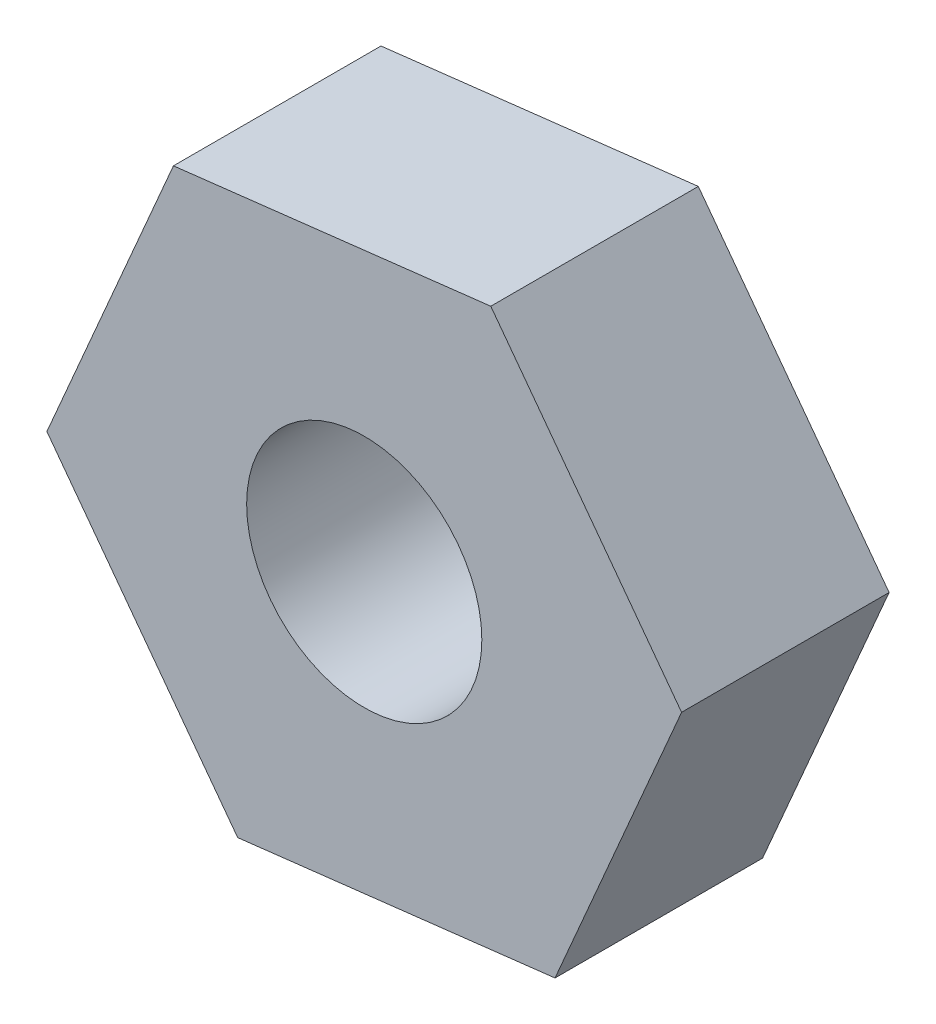
ISO-10303-21;
HEADER;
FILE_DESCRIPTION(('STEP AP214'),'2;1');
FILE_NAME('part.step','',(''),(''),'','','');
FILE_SCHEMA(('AUTOMOTIVE_DESIGN { 1 0 10303 214 1 1 1 1 }'));
ENDSEC;
DATA;
#1=APPLICATION_CONTEXT('core data for automotive mechanical design processes');
#2=APPLICATION_PROTOCOL_DEFINITION('international standard','automotive_design',2000,#1);
#3=PRODUCT_CONTEXT('',#1,'mechanical');
#4=PRODUCT('Part','Part','',(#3));
#5=PRODUCT_RELATED_PRODUCT_CATEGORY('part','',(#4));
#6=PRODUCT_DEFINITION_FORMATION('','',#4);
#7=PRODUCT_DEFINITION_CONTEXT('part definition',#1,'design');
#8=PRODUCT_DEFINITION('design','',#6,#7);
#9=PRODUCT_DEFINITION_SHAPE('','',#8);
#10=(LENGTH_UNIT() NAMED_UNIT(*) SI_UNIT(.MILLI.,.METRE.));
#11=(NAMED_UNIT(*) PLANE_ANGLE_UNIT() SI_UNIT($,.RADIAN.));
#12=(NAMED_UNIT(*) SI_UNIT($,.STERADIAN.) SOLID_ANGLE_UNIT());
#13=UNCERTAINTY_MEASURE_WITH_UNIT(LENGTH_MEASURE(1.E-05),#10,'distance_accuracy_value','');
#14=(GEOMETRIC_REPRESENTATION_CONTEXT(3) GLOBAL_UNCERTAINTY_ASSIGNED_CONTEXT((#13)) GLOBAL_UNIT_ASSIGNED_CONTEXT((#10,
#11,#12)) REPRESENTATION_CONTEXT('',''));
#15=CARTESIAN_POINT('',(0.,0.,0.));
#16=DIRECTION('',(0.,0.,1.));
#17=DIRECTION('',(1.,0.,0.));
#18=AXIS2_PLACEMENT_3D('',#15,#16,#17);
#19=CARTESIAN_POINT('',(0.,0.,1.5));
#20=DIRECTION('',(0.,0.,1.));
#21=DIRECTION('',(1.,0.,0.));
#22=AXIS2_PLACEMENT_3D('',#19,#20,#21);
#23=PLANE('',#22);
#24=DIRECTION('',(0.993240446969853,0.116075038243055,0.));
#25=VECTOR('',#24,1.);
#26=CARTESIAN_POINT('',(-0.914745202370028,-2.12051280309136,1.5));
#27=LINE('',#26,#25);
#28=CARTESIAN_POINT('',(-0.914745202370028,-2.12051280309136,1.5));
#29=VERTEX_POINT('',#28);
#30=CARTESIAN_POINT('',(1.37904535534225,-1.85244898478806,1.5));
#31=VERTEX_POINT('',#30);
#32=EDGE_CURVE('E130',#29,#31,#27,.T.);
#33=ORIENTED_EDGE('',*,*,#32,.T.);
#34=DIRECTION('',(0.39609629162119,0.918208978263631,0.));
#35=VECTOR('',#34,1.);
#36=CARTESIAN_POINT('',(1.37904535534225,-1.85244898478806,1.5));
#37=LINE('',#36,#35);
#38=CARTESIAN_POINT('',(2.29379055771228,0.268063818303296,1.5));
#39=VERTEX_POINT('',#38);
#40=EDGE_CURVE('E88',#31,#39,#37,.T.);
#41=ORIENTED_EDGE('',*,*,#40,.T.);
#42=DIRECTION('',(-0.597144155348662,0.802133940020576,0.));
#43=VECTOR('',#42,1.);
#44=CARTESIAN_POINT('',(2.29379055771228,0.268063818303296,1.5));
#45=LINE('',#44,#43);
#46=CARTESIAN_POINT('',(0.914745202370028,2.12051280309135,1.5));
#47=VERTEX_POINT('',#46);
#48=EDGE_CURVE('E101',#39,#47,#45,.T.);
#49=ORIENTED_EDGE('',*,*,#48,.T.);
#50=DIRECTION('',(-0.993240446969853,-0.116075038243054,0.));
#51=VECTOR('',#50,1.);
#52=CARTESIAN_POINT('',(0.914745202370028,2.12051280309135,1.5));
#53=LINE('',#52,#51);
#54=CARTESIAN_POINT('',(-1.37904535534225,1.85244898478806,1.5));
#55=VERTEX_POINT('',#54);
#56=EDGE_CURVE('E95',#47,#55,#53,.T.);
#57=ORIENTED_EDGE('',*,*,#56,.T.);
#58=DIRECTION('',(-0.396096291621191,-0.918208978263631,0.));
#59=VECTOR('',#58,1.);
#60=CARTESIAN_POINT('',(-1.37904535534225,1.85244898478806,1.5));
#61=LINE('',#60,#59);
#62=CARTESIAN_POINT('',(-2.29379055771228,-0.268063818303295,1.5));
#63=VERTEX_POINT('',#62);
#64=EDGE_CURVE('E99',#55,#63,#61,.T.);
#65=ORIENTED_EDGE('',*,*,#64,.T.);
#66=DIRECTION('',(0.597144155348662,-0.802133940020576,0.));
#67=VECTOR('',#66,1.);
#68=CARTESIAN_POINT('',(-2.29379055771228,-0.268063818303295,1.5));
#69=LINE('',#68,#67);
#70=EDGE_CURVE('E51',#63,#29,#69,.T.);
#71=ORIENTED_EDGE('',*,*,#70,.T.);
#72=EDGE_LOOP('',(#33,#41,#49,#57,#65,#71));
#73=FACE_BOUND('',#72,.T.);
#74=CARTESIAN_POINT('',(0.,0.,1.5));
#75=DIRECTION('',(0.,0.,1.));
#76=DIRECTION('',(1.,0.,0.));
#77=AXIS2_PLACEMENT_3D('',#74,#75,#76);
#78=CIRCLE('',#77,0.85);
#79=CARTESIAN_POINT('',(0.85,0.,1.5));
#80=VERTEX_POINT('',#79);
#81=EDGE_CURVE('E123',#80,#80,#78,.T.);
#82=ORIENTED_EDGE('',*,*,#81,.F.);
#83=EDGE_LOOP('',(#82));
#84=FACE_BOUND('',#83,.T.);
#85=ADVANCED_FACE('F34',(#73,#84),#23,.T.);
#86=CARTESIAN_POINT('',(0.,0.,0.));
#87=DIRECTION('',(0.,0.,1.));
#88=DIRECTION('',(1.,0.,0.));
#89=AXIS2_PLACEMENT_3D('',#86,#87,#88);
#90=PLANE('',#89);
#91=DIRECTION('',(0.993240446969853,0.116075038243055,0.));
#92=VECTOR('',#91,1.);
#93=CARTESIAN_POINT('',(-0.914745202370028,-2.12051280309136,0.));
#94=LINE('',#93,#92);
#95=CARTESIAN_POINT('',(-0.914745202370028,-2.12051280309136,0.));
#96=VERTEX_POINT('',#95);
#97=CARTESIAN_POINT('',(1.37904535534225,-1.85244898478806,0.));
#98=VERTEX_POINT('',#97);
#99=EDGE_CURVE('E119',#96,#98,#94,.T.);
#100=ORIENTED_EDGE('',*,*,#99,.F.);
#101=DIRECTION('',(0.597144155348662,-0.802133940020576,0.));
#102=VECTOR('',#101,1.);
#103=CARTESIAN_POINT('',(-2.29379055771228,-0.268063818303295,0.));
#104=LINE('',#103,#102);
#105=CARTESIAN_POINT('',(-2.29379055771228,-0.268063818303295,0.));
#106=VERTEX_POINT('',#105);
#107=EDGE_CURVE('E80',#106,#96,#104,.T.);
#108=ORIENTED_EDGE('',*,*,#107,.F.);
#109=DIRECTION('',(-0.396096291621191,-0.918208978263631,0.));
#110=VECTOR('',#109,1.);
#111=CARTESIAN_POINT('',(-1.37904535534225,1.85244898478806,0.));
#112=LINE('',#111,#110);
#113=CARTESIAN_POINT('',(-1.37904535534225,1.85244898478806,0.));
#114=VERTEX_POINT('',#113);
#115=EDGE_CURVE('E74',#114,#106,#112,.T.);
#116=ORIENTED_EDGE('',*,*,#115,.F.);
#117=DIRECTION('',(-0.993240446969853,-0.116075038243054,0.));
#118=VECTOR('',#117,1.);
#119=CARTESIAN_POINT('',(0.914745202370028,2.12051280309135,0.));
#120=LINE('',#119,#118);
#121=CARTESIAN_POINT('',(0.914745202370028,2.12051280309135,0.));
#122=VERTEX_POINT('',#121);
#123=EDGE_CURVE('E109',#122,#114,#120,.T.);
#124=ORIENTED_EDGE('',*,*,#123,.F.);
#125=DIRECTION('',(-0.597144155348662,0.802133940020576,0.));
#126=VECTOR('',#125,1.);
#127=CARTESIAN_POINT('',(2.29379055771228,0.268063818303296,0.));
#128=LINE('',#127,#126);
#129=CARTESIAN_POINT('',(2.29379055771228,0.268063818303296,0.));
#130=VERTEX_POINT('',#129);
#131=EDGE_CURVE('E125',#130,#122,#128,.T.);
#132=ORIENTED_EDGE('',*,*,#131,.F.);
#133=DIRECTION('',(0.39609629162119,0.918208978263631,0.));
#134=VECTOR('',#133,1.);
#135=CARTESIAN_POINT('',(1.37904535534225,-1.85244898478806,0.));
#136=LINE('',#135,#134);
#137=EDGE_CURVE('E122',#98,#130,#136,.T.);
#138=ORIENTED_EDGE('',*,*,#137,.F.);
#139=EDGE_LOOP('',(#100,#108,#116,#124,#132,#138));
#140=FACE_BOUND('',#139,.T.);
#141=CARTESIAN_POINT('',(0.,0.,0.));
#142=DIRECTION('',(0.,0.,1.));
#143=DIRECTION('',(1.,0.,0.));
#144=AXIS2_PLACEMENT_3D('',#141,#142,#143);
#145=CIRCLE('',#144,0.85);
#146=CARTESIAN_POINT('',(0.85,0.,0.));
#147=VERTEX_POINT('',#146);
#148=EDGE_CURVE('E223',#147,#147,#145,.T.);
#149=ORIENTED_EDGE('',*,*,#148,.T.);
#150=EDGE_LOOP('',(#149));
#151=FACE_BOUND('',#150,.T.);
#152=ADVANCED_FACE('F139',(#140,#151),#90,.F.);
#153=CARTESIAN_POINT('',(-0.914745202370028,-2.12051280309136,1.5));
#154=DIRECTION('',(-0.116075038243055,0.993240446969853,0.));
#155=DIRECTION('',(-0.993240446969853,-0.116075038243055,0.));
#156=AXIS2_PLACEMENT_3D('',#153,#154,#155);
#157=PLANE('',#156);
#158=ORIENTED_EDGE('',*,*,#99,.T.);
#159=DIRECTION('',(0.,0.,-1.));
#160=VECTOR('',#159,1.);
#161=CARTESIAN_POINT('',(1.37904535534225,-1.85244898478806,1.5));
#162=LINE('',#161,#160);
#163=EDGE_CURVE('E11',#31,#98,#162,.T.);
#164=ORIENTED_EDGE('',*,*,#163,.F.);
#165=ORIENTED_EDGE('',*,*,#32,.F.);
#166=DIRECTION('',(0.,0.,-1.));
#167=VECTOR('',#166,1.);
#168=CARTESIAN_POINT('',(-0.914745202370028,-2.12051280309136,1.5));
#169=LINE('',#168,#167);
#170=EDGE_CURVE('E115',#29,#96,#169,.T.);
#171=ORIENTED_EDGE('',*,*,#170,.T.);
#172=EDGE_LOOP('',(#158,#164,#165,#171));
#173=FACE_BOUND('',#172,.T.);
#174=ADVANCED_FACE('F36',(#173),#157,.F.);
#175=CARTESIAN_POINT('',(1.37904535534225,-1.85244898478806,1.5));
#176=DIRECTION('',(-0.918208978263631,0.39609629162119,0.));
#177=DIRECTION('',(-0.39609629162119,-0.918208978263631,0.));
#178=AXIS2_PLACEMENT_3D('',#175,#176,#177);
#179=PLANE('',#178);
#180=ORIENTED_EDGE('',*,*,#137,.T.);
#181=DIRECTION('',(0.,0.,-1.));
#182=VECTOR('',#181,1.);
#183=CARTESIAN_POINT('',(2.29379055771228,0.268063818303296,1.5));
#184=LINE('',#183,#182);
#185=EDGE_CURVE('E43',#39,#130,#184,.T.);
#186=ORIENTED_EDGE('',*,*,#185,.F.);
#187=ORIENTED_EDGE('',*,*,#40,.F.);
#188=ORIENTED_EDGE('',*,*,#163,.T.);
#189=EDGE_LOOP('',(#180,#186,#187,#188));
#190=FACE_BOUND('',#189,.T.);
#191=ADVANCED_FACE('F164',(#190),#179,.F.);
#192=CARTESIAN_POINT('',(2.29379055771228,0.268063818303296,1.5));
#193=DIRECTION('',(-0.802133940020576,-0.597144155348662,0.));
#194=DIRECTION('',(0.597144155348662,-0.802133940020576,0.));
#195=AXIS2_PLACEMENT_3D('',#192,#193,#194);
#196=PLANE('',#195);
#197=ORIENTED_EDGE('',*,*,#131,.T.);
#198=DIRECTION('',(0.,0.,-1.));
#199=VECTOR('',#198,1.);
#200=CARTESIAN_POINT('',(0.914745202370028,2.12051280309135,1.5));
#201=LINE('',#200,#199);
#202=EDGE_CURVE('E110',#47,#122,#201,.T.);
#203=ORIENTED_EDGE('',*,*,#202,.F.);
#204=ORIENTED_EDGE('',*,*,#48,.F.);
#205=ORIENTED_EDGE('',*,*,#185,.T.);
#206=EDGE_LOOP('',(#197,#203,#204,#205));
#207=FACE_BOUND('',#206,.T.);
#208=ADVANCED_FACE('F136',(#207),#196,.F.);
#209=CARTESIAN_POINT('',(0.914745202370028,2.12051280309135,1.5));
#210=DIRECTION('',(0.116075038243054,-0.993240446969853,0.));
#211=DIRECTION('',(0.993240446969853,0.116075038243054,0.));
#212=AXIS2_PLACEMENT_3D('',#209,#210,#211);
#213=PLANE('',#212);
#214=ORIENTED_EDGE('',*,*,#123,.T.);
#215=DIRECTION('',(0.,0.,-1.));
#216=VECTOR('',#215,1.);
#217=CARTESIAN_POINT('',(-1.37904535534225,1.85244898478806,1.5));
#218=LINE('',#217,#216);
#219=EDGE_CURVE('E106',#55,#114,#218,.T.);
#220=ORIENTED_EDGE('',*,*,#219,.F.);
#221=ORIENTED_EDGE('',*,*,#56,.F.);
#222=ORIENTED_EDGE('',*,*,#202,.T.);
#223=EDGE_LOOP('',(#214,#220,#221,#222));
#224=FACE_BOUND('',#223,.T.);
#225=ADVANCED_FACE('F107',(#224),#213,.F.);
#226=CARTESIAN_POINT('',(-1.37904535534225,1.85244898478806,1.5));
#227=DIRECTION('',(0.918208978263631,-0.396096291621191,0.));
#228=DIRECTION('',(0.396096291621191,0.918208978263631,0.));
#229=AXIS2_PLACEMENT_3D('',#226,#227,#228);
#230=PLANE('',#229);
#231=ORIENTED_EDGE('',*,*,#115,.T.);
#232=DIRECTION('',(0.,0.,-1.));
#233=VECTOR('',#232,1.);
#234=CARTESIAN_POINT('',(-2.29379055771228,-0.268063818303295,1.5));
#235=LINE('',#234,#233);
#236=EDGE_CURVE('E111',#63,#106,#235,.T.);
#237=ORIENTED_EDGE('',*,*,#236,.F.);
#238=ORIENTED_EDGE('',*,*,#64,.F.);
#239=ORIENTED_EDGE('',*,*,#219,.T.);
#240=EDGE_LOOP('',(#231,#237,#238,#239));
#241=FACE_BOUND('',#240,.T.);
#242=ADVANCED_FACE('F113',(#241),#230,.F.);
#243=CARTESIAN_POINT('',(-2.29379055771228,-0.268063818303295,1.5));
#244=DIRECTION('',(0.802133940020576,0.597144155348662,0.));
#245=DIRECTION('',(-0.597144155348662,0.802133940020576,0.));
#246=AXIS2_PLACEMENT_3D('',#243,#244,#245);
#247=PLANE('',#246);
#248=ORIENTED_EDGE('',*,*,#107,.T.);
#249=ORIENTED_EDGE('',*,*,#170,.F.);
#250=ORIENTED_EDGE('',*,*,#70,.F.);
#251=ORIENTED_EDGE('',*,*,#236,.T.);
#252=EDGE_LOOP('',(#248,#249,#250,#251));
#253=FACE_BOUND('',#252,.T.);
#254=ADVANCED_FACE('F144',(#253),#247,.F.);
#255=CARTESIAN_POINT('',(0.,0.,1.5));
#256=DIRECTION('',(0.,0.,-1.));
#257=DIRECTION('',(-1.,0.,0.));
#258=AXIS2_PLACEMENT_3D('',#255,#256,#257);
#259=CYLINDRICAL_SURFACE('',#258,0.85);
#260=ORIENTED_EDGE('',*,*,#81,.T.);
#261=EDGE_LOOP('',(#260));
#262=FACE_BOUND('',#261,.T.);
#263=ORIENTED_EDGE('',*,*,#148,.F.);
#264=EDGE_LOOP('',(#263));
#265=FACE_BOUND('',#264,.T.);
#266=ADVANCED_FACE('F146',(#262,#265),#259,.F.);
#267=CLOSED_SHELL('',(#85,#152,#174,#191,#208,#225,#242,#254,#266));
#268=MANIFOLD_SOLID_BREP('B2',#267);
#269=ADVANCED_BREP_SHAPE_REPRESENTATION('',(#18,#268),#14);
#270=SHAPE_DEFINITION_REPRESENTATION(#9,#269);
ENDSEC;
END-ISO-10303-21;
